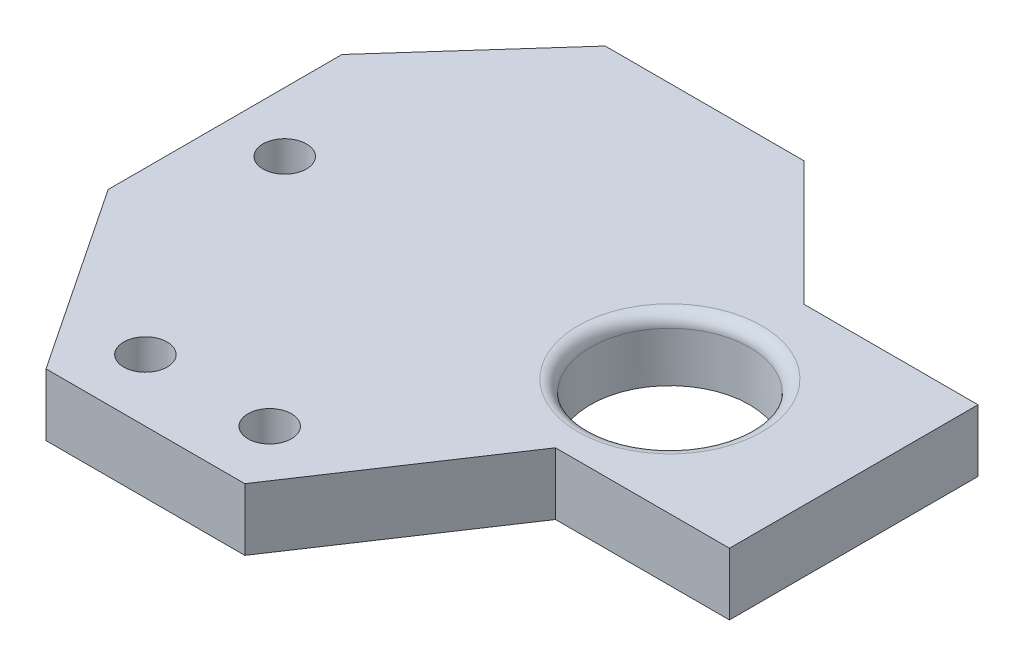
ISO-10303-21;
HEADER;
FILE_DESCRIPTION(('STEP AP214'),'2;1');
FILE_NAME('part.step','',(''),(''),'','','');
FILE_SCHEMA(('AUTOMOTIVE_DESIGN { 1 0 10303 214 1 1 1 1 }'));
ENDSEC;
DATA;
#1=APPLICATION_CONTEXT('core data for automotive mechanical design processes');
#2=APPLICATION_PROTOCOL_DEFINITION('international standard','automotive_design',2000,#1);
#3=PRODUCT_CONTEXT('',#1,'mechanical');
#4=PRODUCT('Part','Part','',(#3));
#5=PRODUCT_RELATED_PRODUCT_CATEGORY('part','',(#4));
#6=PRODUCT_DEFINITION_FORMATION('','',#4);
#7=PRODUCT_DEFINITION_CONTEXT('part definition',#1,'design');
#8=PRODUCT_DEFINITION('design','',#6,#7);
#9=PRODUCT_DEFINITION_SHAPE('','',#8);
#10=(LENGTH_UNIT() NAMED_UNIT(*) SI_UNIT(.MILLI.,.METRE.));
#11=(NAMED_UNIT(*) PLANE_ANGLE_UNIT() SI_UNIT($,.RADIAN.));
#12=(NAMED_UNIT(*) SI_UNIT($,.STERADIAN.) SOLID_ANGLE_UNIT());
#13=UNCERTAINTY_MEASURE_WITH_UNIT(LENGTH_MEASURE(1.E-05),#10,'distance_accuracy_value','');
#14=(GEOMETRIC_REPRESENTATION_CONTEXT(3) GLOBAL_UNCERTAINTY_ASSIGNED_CONTEXT((#13)) GLOBAL_UNIT_ASSIGNED_CONTEXT((#10,
#11,#12)) REPRESENTATION_CONTEXT('',''));
#15=CARTESIAN_POINT('',(0.,0.,0.));
#16=DIRECTION('',(0.,0.,1.));
#17=DIRECTION('',(1.,0.,0.));
#18=AXIS2_PLACEMENT_3D('',#15,#16,#17);
#19=CARTESIAN_POINT('',(50.,5.,0.));
#20=DIRECTION('',(-1.,0.,0.));
#21=DIRECTION('',(0.,0.,1.));
#22=AXIS2_PLACEMENT_3D('',#19,#20,#21);
#23=PLANE('',#22);
#24=DIRECTION('',(0.,0.,-1.));
#25=VECTOR('',#24,1.);
#26=CARTESIAN_POINT('',(50.,0.,0.));
#27=LINE('',#26,#25);
#28=CARTESIAN_POINT('',(50.,0.,-15.));
#29=VERTEX_POINT('',#28);
#30=CARTESIAN_POINT('',(50.,0.,-35.));
#31=VERTEX_POINT('',#30);
#32=EDGE_CURVE('E167',#29,#31,#27,.T.);
#33=ORIENTED_EDGE('',*,*,#32,.T.);
#34=DIRECTION('',(0.,-1.,0.));
#35=VECTOR('',#34,1.);
#36=CARTESIAN_POINT('',(50.,5.,-35.));
#37=LINE('',#36,#35);
#38=CARTESIAN_POINT('',(50.,5.,-35.));
#39=VERTEX_POINT('',#38);
#40=EDGE_CURVE('E222',#39,#31,#37,.T.);
#41=ORIENTED_EDGE('',*,*,#40,.F.);
#42=DIRECTION('',(0.,0.,-1.));
#43=VECTOR('',#42,1.);
#44=CARTESIAN_POINT('',(50.,5.,0.));
#45=LINE('',#44,#43);
#46=CARTESIAN_POINT('',(50.,5.,-15.));
#47=VERTEX_POINT('',#46);
#48=EDGE_CURVE('E108',#47,#39,#45,.T.);
#49=ORIENTED_EDGE('',*,*,#48,.F.);
#50=DIRECTION('',(0.,-1.,0.));
#51=VECTOR('',#50,1.);
#52=CARTESIAN_POINT('',(50.,5.,-15.));
#53=LINE('',#52,#51);
#54=EDGE_CURVE('E154',#47,#29,#53,.T.);
#55=ORIENTED_EDGE('',*,*,#54,.T.);
#56=EDGE_LOOP('',(#33,#41,#49,#55));
#57=FACE_BOUND('',#56,.T.);
#58=ADVANCED_FACE('F43',(#57),#23,.F.);
#59=CARTESIAN_POINT('',(0.,5.,-35.));
#60=DIRECTION('',(0.,0.,-1.));
#61=DIRECTION('',(-1.,0.,0.));
#62=AXIS2_PLACEMENT_3D('',#59,#60,#61);
#63=PLANE('',#62);
#64=DIRECTION('',(1.,0.,0.));
#65=VECTOR('',#64,1.);
#66=CARTESIAN_POINT('',(0.,0.,-35.));
#67=LINE('',#66,#65);
#68=CARTESIAN_POINT('',(36.,0.,-35.));
#69=VERTEX_POINT('',#68);
#70=EDGE_CURVE('E171',#69,#31,#67,.T.);
#71=ORIENTED_EDGE('',*,*,#70,.F.);
#72=DIRECTION('',(0.,-1.,0.));
#73=VECTOR('',#72,1.);
#74=CARTESIAN_POINT('',(36.,5.,-35.));
#75=LINE('',#74,#73);
#76=CARTESIAN_POINT('',(36.,5.,-35.));
#77=VERTEX_POINT('',#76);
#78=EDGE_CURVE('E219',#77,#69,#75,.T.);
#79=ORIENTED_EDGE('',*,*,#78,.F.);
#80=DIRECTION('',(1.,0.,0.));
#81=VECTOR('',#80,1.);
#82=CARTESIAN_POINT('',(0.,5.,-35.));
#83=LINE('',#82,#81);
#84=EDGE_CURVE('E279',#77,#39,#83,.T.);
#85=ORIENTED_EDGE('',*,*,#84,.T.);
#86=ORIENTED_EDGE('',*,*,#40,.T.);
#87=EDGE_LOOP('',(#71,#79,#85,#86));
#88=FACE_BOUND('',#87,.T.);
#89=ADVANCED_FACE('F241',(#88),#63,.T.);
#90=CARTESIAN_POINT('',(35.5,5.,-35.5));
#91=DIRECTION('',(0.707106781186547,0.,-0.707106781186548));
#92=DIRECTION('',(-0.707106781186548,0.,-0.707106781186547));
#93=AXIS2_PLACEMENT_3D('',#90,#91,#92);
#94=PLANE('',#93);
#95=DIRECTION('',(0.707106781186548,0.,0.707106781186547));
#96=VECTOR('',#95,1.);
#97=CARTESIAN_POINT('',(35.5,0.,-35.5));
#98=LINE('',#97,#96);
#99=CARTESIAN_POINT('',(26.,0.,-45.));
#100=VERTEX_POINT('',#99);
#101=EDGE_CURVE('E175',#100,#69,#98,.T.);
#102=ORIENTED_EDGE('',*,*,#101,.F.);
#103=DIRECTION('',(0.,-1.,0.));
#104=VECTOR('',#103,1.);
#105=CARTESIAN_POINT('',(26.,5.,-45.));
#106=LINE('',#105,#104);
#107=CARTESIAN_POINT('',(26.,5.,-45.));
#108=VERTEX_POINT('',#107);
#109=EDGE_CURVE('E216',#108,#100,#106,.T.);
#110=ORIENTED_EDGE('',*,*,#109,.F.);
#111=DIRECTION('',(0.707106781186548,0.,0.707106781186547));
#112=VECTOR('',#111,1.);
#113=CARTESIAN_POINT('',(35.5,5.,-35.5));
#114=LINE('',#113,#112);
#115=EDGE_CURVE('E284',#108,#77,#114,.T.);
#116=ORIENTED_EDGE('',*,*,#115,.T.);
#117=ORIENTED_EDGE('',*,*,#78,.T.);
#118=EDGE_LOOP('',(#102,#110,#116,#117));
#119=FACE_BOUND('',#118,.T.);
#120=ADVANCED_FACE('F247',(#119),#94,.T.);
#121=CARTESIAN_POINT('',(0.,5.,-45.));
#122=DIRECTION('',(0.,0.,-1.));
#123=DIRECTION('',(-1.,0.,0.));
#124=AXIS2_PLACEMENT_3D('',#121,#122,#123);
#125=PLANE('',#124);
#126=DIRECTION('',(1.,0.,0.));
#127=VECTOR('',#126,1.);
#128=CARTESIAN_POINT('',(0.,0.,-45.));
#129=LINE('',#128,#127);
#130=CARTESIAN_POINT('',(10.,0.,-45.));
#131=VERTEX_POINT('',#130);
#132=EDGE_CURVE('E179',#131,#100,#129,.T.);
#133=ORIENTED_EDGE('',*,*,#132,.F.);
#134=DIRECTION('',(0.,-1.,0.));
#135=VECTOR('',#134,1.);
#136=CARTESIAN_POINT('',(10.,5.,-45.));
#137=LINE('',#136,#135);
#138=CARTESIAN_POINT('',(10.,5.,-45.));
#139=VERTEX_POINT('',#138);
#140=EDGE_CURVE('E213',#139,#131,#137,.T.);
#141=ORIENTED_EDGE('',*,*,#140,.F.);
#142=DIRECTION('',(1.,0.,0.));
#143=VECTOR('',#142,1.);
#144=CARTESIAN_POINT('',(0.,5.,-45.));
#145=LINE('',#144,#143);
#146=EDGE_CURVE('E293',#139,#108,#145,.T.);
#147=ORIENTED_EDGE('',*,*,#146,.T.);
#148=ORIENTED_EDGE('',*,*,#109,.T.);
#149=EDGE_LOOP('',(#133,#141,#147,#148));
#150=FACE_BOUND('',#149,.T.);
#151=ADVANCED_FACE('F330',(#150),#125,.T.);
#152=CARTESIAN_POINT('',(-16.8051242194423,5.,-15.0309600500005));
#153=DIRECTION('',(-0.74535599249993,0.,-0.666666666666667));
#154=DIRECTION('',(-0.666666666666667,0.,0.74535599249993));
#155=AXIS2_PLACEMENT_3D('',#152,#153,#154);
#156=PLANE('',#155);
#157=DIRECTION('',(0.666666666666667,0.,-0.74535599249993));
#158=VECTOR('',#157,1.);
#159=CARTESIAN_POINT('',(-16.8051242194423,0.,-15.0309600500005));
#160=LINE('',#159,#158);
#161=CARTESIAN_POINT('',(0.,0.,-33.8196601125011));
#162=VERTEX_POINT('',#161);
#163=EDGE_CURVE('E183',#162,#131,#160,.T.);
#164=ORIENTED_EDGE('',*,*,#163,.F.);
#165=DIRECTION('',(0.,-1.,0.));
#166=VECTOR('',#165,1.);
#167=CARTESIAN_POINT('',(0.,5.,-33.8196601125011));
#168=LINE('',#167,#166);
#169=CARTESIAN_POINT('',(0.,5.,-33.8196601125011));
#170=VERTEX_POINT('',#169);
#171=EDGE_CURVE('E210',#170,#162,#168,.T.);
#172=ORIENTED_EDGE('',*,*,#171,.F.);
#173=DIRECTION('',(0.666666666666667,0.,-0.74535599249993));
#174=VECTOR('',#173,1.);
#175=CARTESIAN_POINT('',(-16.8051242194423,5.,-15.0309600500005));
#176=LINE('',#175,#174);
#177=EDGE_CURVE('E297',#170,#139,#176,.T.);
#178=ORIENTED_EDGE('',*,*,#177,.T.);
#179=ORIENTED_EDGE('',*,*,#140,.T.);
#180=EDGE_LOOP('',(#164,#172,#178,#179));
#181=FACE_BOUND('',#180,.T.);
#182=ADVANCED_FACE('F313',(#181),#156,.T.);
#183=CARTESIAN_POINT('',(0.,5.,0.));
#184=DIRECTION('',(-1.,0.,0.));
#185=DIRECTION('',(0.,0.,1.));
#186=AXIS2_PLACEMENT_3D('',#183,#184,#185);
#187=PLANE('',#186);
#188=DIRECTION('',(0.,0.,-1.));
#189=VECTOR('',#188,1.);
#190=CARTESIAN_POINT('',(0.,0.,0.));
#191=LINE('',#190,#189);
#192=CARTESIAN_POINT('',(0.,0.,-15.));
#193=VERTEX_POINT('',#192);
#194=EDGE_CURVE('E187',#193,#162,#191,.T.);
#195=ORIENTED_EDGE('',*,*,#194,.F.);
#196=DIRECTION('',(0.,-1.,0.));
#197=VECTOR('',#196,1.);
#198=CARTESIAN_POINT('',(0.,5.,-15.));
#199=LINE('',#198,#197);
#200=CARTESIAN_POINT('',(0.,5.,-15.));
#201=VERTEX_POINT('',#200);
#202=EDGE_CURVE('E207',#201,#193,#199,.T.);
#203=ORIENTED_EDGE('',*,*,#202,.F.);
#204=DIRECTION('',(0.,0.,-1.));
#205=VECTOR('',#204,1.);
#206=CARTESIAN_POINT('',(0.,5.,0.));
#207=LINE('',#206,#205);
#208=EDGE_CURVE('E301',#201,#170,#207,.T.);
#209=ORIENTED_EDGE('',*,*,#208,.T.);
#210=ORIENTED_EDGE('',*,*,#171,.T.);
#211=EDGE_LOOP('',(#195,#203,#209,#210));
#212=FACE_BOUND('',#211,.T.);
#213=ADVANCED_FACE('F307',(#212),#187,.T.);
#214=CARTESIAN_POINT('',(6.92307692307692,5.,-4.61538461538462));
#215=DIRECTION('',(0.832050294337844,0.,-0.554700196225229));
#216=DIRECTION('',(-0.554700196225229,0.,-0.832050294337844));
#217=AXIS2_PLACEMENT_3D('',#214,#215,#216);
#218=PLANE('',#217);
#219=DIRECTION('',(0.554700196225229,0.,0.832050294337844));
#220=VECTOR('',#219,1.);
#221=CARTESIAN_POINT('',(6.92307692307692,0.,-4.61538461538462));
#222=LINE('',#221,#220);
#223=CARTESIAN_POINT('',(10.,0.,0.));
#224=VERTEX_POINT('',#223);
#225=EDGE_CURVE('E191',#193,#224,#222,.T.);
#226=ORIENTED_EDGE('',*,*,#225,.T.);
#227=DIRECTION('',(0.,-1.,0.));
#228=VECTOR('',#227,1.);
#229=CARTESIAN_POINT('',(10.,5.,0.));
#230=LINE('',#229,#228);
#231=CARTESIAN_POINT('',(10.,5.,0.));
#232=VERTEX_POINT('',#231);
#233=EDGE_CURVE('E147',#232,#224,#230,.T.);
#234=ORIENTED_EDGE('',*,*,#233,.F.);
#235=DIRECTION('',(0.554700196225229,0.,0.832050294337844));
#236=VECTOR('',#235,1.);
#237=CARTESIAN_POINT('',(6.92307692307692,5.,-4.61538461538462));
#238=LINE('',#237,#236);
#239=EDGE_CURVE('E136',#201,#232,#238,.T.);
#240=ORIENTED_EDGE('',*,*,#239,.F.);
#241=ORIENTED_EDGE('',*,*,#202,.T.);
#242=EDGE_LOOP('',(#226,#234,#240,#241));
#243=FACE_BOUND('',#242,.T.);
#244=ADVANCED_FACE('F317',(#243),#218,.F.);
#245=CARTESIAN_POINT('',(0.,5.,0.));
#246=DIRECTION('',(0.,0.,-1.));
#247=DIRECTION('',(-1.,0.,0.));
#248=AXIS2_PLACEMENT_3D('',#245,#246,#247);
#249=PLANE('',#248);
#250=DIRECTION('',(1.,0.,0.));
#251=VECTOR('',#250,1.);
#252=CARTESIAN_POINT('',(0.,0.,0.));
#253=LINE('',#252,#251);
#254=CARTESIAN_POINT('',(26.,0.,0.));
#255=VERTEX_POINT('',#254);
#256=EDGE_CURVE('E145',#224,#255,#253,.T.);
#257=ORIENTED_EDGE('',*,*,#256,.T.);
#258=DIRECTION('',(0.,-1.,0.));
#259=VECTOR('',#258,1.);
#260=CARTESIAN_POINT('',(26.,5.,0.));
#261=LINE('',#260,#259);
#262=CARTESIAN_POINT('',(26.,5.,0.));
#263=VERTEX_POINT('',#262);
#264=EDGE_CURVE('E142',#263,#255,#261,.T.);
#265=ORIENTED_EDGE('',*,*,#264,.F.);
#266=DIRECTION('',(1.,0.,0.));
#267=VECTOR('',#266,1.);
#268=CARTESIAN_POINT('',(0.,5.,0.));
#269=LINE('',#268,#267);
#270=EDGE_CURVE('E129',#232,#263,#269,.T.);
#271=ORIENTED_EDGE('',*,*,#270,.F.);
#272=ORIENTED_EDGE('',*,*,#233,.T.);
#273=EDGE_LOOP('',(#257,#265,#271,#272));
#274=FACE_BOUND('',#273,.T.);
#275=ADVANCED_FACE('F143',(#274),#249,.F.);
#276=CARTESIAN_POINT('',(18.,5.,12.));
#277=DIRECTION('',(-0.832050294337844,0.,-0.554700196225229));
#278=DIRECTION('',(-0.554700196225229,0.,0.832050294337844));
#279=AXIS2_PLACEMENT_3D('',#276,#277,#278);
#280=PLANE('',#279);
#281=DIRECTION('',(0.554700196225229,0.,-0.832050294337844));
#282=VECTOR('',#281,1.);
#283=CARTESIAN_POINT('',(18.,0.,12.));
#284=LINE('',#283,#282);
#285=CARTESIAN_POINT('',(36.,0.,-15.));
#286=VERTEX_POINT('',#285);
#287=EDGE_CURVE('E96',#255,#286,#284,.T.);
#288=ORIENTED_EDGE('',*,*,#287,.T.);
#289=DIRECTION('',(0.,-1.,0.));
#290=VECTOR('',#289,1.);
#291=CARTESIAN_POINT('',(36.,5.,-15.));
#292=LINE('',#291,#290);
#293=CARTESIAN_POINT('',(36.,5.,-15.));
#294=VERTEX_POINT('',#293);
#295=EDGE_CURVE('E148',#294,#286,#292,.T.);
#296=ORIENTED_EDGE('',*,*,#295,.F.);
#297=DIRECTION('',(0.554700196225229,0.,-0.832050294337844));
#298=VECTOR('',#297,1.);
#299=CARTESIAN_POINT('',(18.,5.,12.));
#300=LINE('',#299,#298);
#301=EDGE_CURVE('E133',#263,#294,#300,.T.);
#302=ORIENTED_EDGE('',*,*,#301,.F.);
#303=ORIENTED_EDGE('',*,*,#264,.T.);
#304=EDGE_LOOP('',(#288,#296,#302,#303));
#305=FACE_BOUND('',#304,.T.);
#306=ADVANCED_FACE('F150',(#305),#280,.F.);
#307=CARTESIAN_POINT('',(23.,5.,-5.));
#308=DIRECTION('',(0.,-1.,0.));
#309=DIRECTION('',(0.,0.,-1.));
#310=AXIS2_PLACEMENT_3D('',#307,#308,#309);
#311=CYLINDRICAL_SURFACE('',#310,1.75);
#312=CARTESIAN_POINT('',(23.,5.,-5.));
#313=DIRECTION('',(0.,1.,0.));
#314=DIRECTION('',(0.,0.,1.));
#315=AXIS2_PLACEMENT_3D('',#312,#313,#314);
#316=CIRCLE('',#315,1.75);
#317=CARTESIAN_POINT('',(23.,5.,-3.25));
#318=VERTEX_POINT('',#317);
#319=EDGE_CURVE('E280',#318,#318,#316,.T.);
#320=ORIENTED_EDGE('',*,*,#319,.T.);
#321=EDGE_LOOP('',(#320));
#322=FACE_BOUND('',#321,.T.);
#323=CARTESIAN_POINT('',(23.,0.,-5.));
#324=DIRECTION('',(0.,1.,0.));
#325=DIRECTION('',(0.,0.,1.));
#326=AXIS2_PLACEMENT_3D('',#323,#324,#325);
#327=CIRCLE('',#326,1.75);
#328=CARTESIAN_POINT('',(23.,0.,-3.25));
#329=VERTEX_POINT('',#328);
#330=EDGE_CURVE('E162',#329,#329,#327,.T.);
#331=ORIENTED_EDGE('',*,*,#330,.F.);
#332=EDGE_LOOP('',(#331));
#333=FACE_BOUND('',#332,.T.);
#334=ADVANCED_FACE('F252',(#322,#333),#311,.F.);
#335=CARTESIAN_POINT('',(13.,5.,-5.));
#336=DIRECTION('',(0.,-1.,0.));
#337=DIRECTION('',(0.,0.,-1.));
#338=AXIS2_PLACEMENT_3D('',#335,#336,#337);
#339=CYLINDRICAL_SURFACE('',#338,1.75);
#340=CARTESIAN_POINT('',(13.,5.,-5.));
#341=DIRECTION('',(0.,1.,0.));
#342=DIRECTION('',(0.,0.,1.));
#343=AXIS2_PLACEMENT_3D('',#340,#341,#342);
#344=CIRCLE('',#343,1.75);
#345=CARTESIAN_POINT('',(13.,5.,-3.25));
#346=VERTEX_POINT('',#345);
#347=EDGE_CURVE('E200',#346,#346,#344,.T.);
#348=ORIENTED_EDGE('',*,*,#347,.T.);
#349=EDGE_LOOP('',(#348));
#350=FACE_BOUND('',#349,.T.);
#351=CARTESIAN_POINT('',(13.,0.,-5.));
#352=DIRECTION('',(0.,1.,0.));
#353=DIRECTION('',(0.,0.,1.));
#354=AXIS2_PLACEMENT_3D('',#351,#352,#353);
#355=CIRCLE('',#354,1.75);
#356=CARTESIAN_POINT('',(13.,0.,-3.25));
#357=VERTEX_POINT('',#356);
#358=EDGE_CURVE('E158',#357,#357,#355,.T.);
#359=ORIENTED_EDGE('',*,*,#358,.F.);
#360=EDGE_LOOP('',(#359));
#361=FACE_BOUND('',#360,.T.);
#362=ADVANCED_FACE('F254',(#350,#361),#339,.F.);
#363=CARTESIAN_POINT('',(0.,5.,-15.));
#364=DIRECTION('',(0.,0.,-1.));
#365=DIRECTION('',(-1.,0.,0.));
#366=AXIS2_PLACEMENT_3D('',#363,#364,#365);
#367=PLANE('',#366);
#368=DIRECTION('',(1.,0.,0.));
#369=VECTOR('',#368,1.);
#370=CARTESIAN_POINT('',(0.,0.,-15.));
#371=LINE('',#370,#369);
#372=EDGE_CURVE('E102',#286,#29,#371,.T.);
#373=ORIENTED_EDGE('',*,*,#372,.T.);
#374=ORIENTED_EDGE('',*,*,#54,.F.);
#375=DIRECTION('',(1.,0.,0.));
#376=VECTOR('',#375,1.);
#377=CARTESIAN_POINT('',(0.,5.,-15.));
#378=LINE('',#377,#376);
#379=EDGE_CURVE('E61',#294,#47,#378,.T.);
#380=ORIENTED_EDGE('',*,*,#379,.F.);
#381=ORIENTED_EDGE('',*,*,#295,.T.);
#382=EDGE_LOOP('',(#373,#374,#380,#381));
#383=FACE_BOUND('',#382,.T.);
#384=ADVANCED_FACE('F257',(#383),#367,.F.);
#385=CARTESIAN_POINT('',(0.,5.,0.));
#386=DIRECTION('',(0.,1.,0.));
#387=DIRECTION('',(0.,0.,1.));
#388=AXIS2_PLACEMENT_3D('',#385,#386,#387);
#389=PLANE('',#388);
#390=CARTESIAN_POINT('',(35.8,5.,-24.4098300562505));
#391=DIRECTION('',(0.,1.,0.));
#392=DIRECTION('',(0.,0.,1.));
#393=AXIS2_PLACEMENT_3D('',#390,#391,#392);
#394=CIRCLE('',#393,7.4);
#395=CARTESIAN_POINT('',(35.8,5.,-17.0098300562505));
#396=VERTEX_POINT('',#395);
#397=EDGE_CURVE('E11',#396,#396,#394,.F.);
#398=ORIENTED_EDGE('',*,*,#397,.T.);
#399=EDGE_LOOP('',(#398));
#400=FACE_BOUND('',#399,.T.);
#401=CARTESIAN_POINT('',(4.8,5.,-24.4098300562505));
#402=DIRECTION('',(0.,1.,0.));
#403=DIRECTION('',(0.,0.,1.));
#404=AXIS2_PLACEMENT_3D('',#401,#402,#403);
#405=CIRCLE('',#404,1.75);
#406=CARTESIAN_POINT('',(4.8,5.,-22.6598300562505));
#407=VERTEX_POINT('',#406);
#408=EDGE_CURVE('E163',#407,#407,#405,.T.);
#409=ORIENTED_EDGE('',*,*,#408,.F.);
#410=EDGE_LOOP('',(#409));
#411=FACE_BOUND('',#410,.T.);
#412=ORIENTED_EDGE('',*,*,#347,.F.);
#413=EDGE_LOOP('',(#412));
#414=FACE_BOUND('',#413,.T.);
#415=ORIENTED_EDGE('',*,*,#319,.F.);
#416=EDGE_LOOP('',(#415));
#417=FACE_BOUND('',#416,.T.);
#418=ORIENTED_EDGE('',*,*,#48,.T.);
#419=ORIENTED_EDGE('',*,*,#84,.F.);
#420=ORIENTED_EDGE('',*,*,#115,.F.);
#421=ORIENTED_EDGE('',*,*,#146,.F.);
#422=ORIENTED_EDGE('',*,*,#177,.F.);
#423=ORIENTED_EDGE('',*,*,#208,.F.);
#424=ORIENTED_EDGE('',*,*,#239,.T.);
#425=ORIENTED_EDGE('',*,*,#270,.T.);
#426=ORIENTED_EDGE('',*,*,#301,.T.);
#427=ORIENTED_EDGE('',*,*,#379,.T.);
#428=EDGE_LOOP('',(#418,#419,#420,#421,#422,#423,#424,#425,#426,#427));
#429=FACE_BOUND('',#428,.T.);
#430=ADVANCED_FACE('F131',(#400,#411,#414,#417,#429),#389,.T.);
#431=CARTESIAN_POINT('',(0.,0.,0.));
#432=DIRECTION('',(0.,1.,0.));
#433=DIRECTION('',(0.,0.,1.));
#434=AXIS2_PLACEMENT_3D('',#431,#432,#433);
#435=PLANE('',#434);
#436=CARTESIAN_POINT('',(4.8,0.,-24.4098300562505));
#437=DIRECTION('',(0.,-1.,0.));
#438=DIRECTION('',(0.,0.,-1.));
#439=AXIS2_PLACEMENT_3D('',#436,#437,#438);
#440=CIRCLE('',#439,1.75);
#441=CARTESIAN_POINT('',(4.8,0.,-26.1598300562505));
#442=VERTEX_POINT('',#441);
#443=EDGE_CURVE('E451',#442,#442,#440,.T.);
#444=ORIENTED_EDGE('',*,*,#443,.F.);
#445=EDGE_LOOP('',(#444));
#446=FACE_BOUND('',#445,.T.);
#447=CARTESIAN_POINT('',(35.8,0.,-24.4098300562505));
#448=DIRECTION('',(0.,-1.,0.));
#449=DIRECTION('',(0.,0.,-1.));
#450=AXIS2_PLACEMENT_3D('',#447,#448,#449);
#451=CIRCLE('',#450,6.4);
#452=CARTESIAN_POINT('',(35.8,0.,-30.8098300562505));
#453=VERTEX_POINT('',#452);
#454=EDGE_CURVE('E452',#453,#453,#451,.T.);
#455=ORIENTED_EDGE('',*,*,#454,.F.);
#456=EDGE_LOOP('',(#455));
#457=FACE_BOUND('',#456,.T.);
#458=ORIENTED_EDGE('',*,*,#358,.T.);
#459=EDGE_LOOP('',(#458));
#460=FACE_BOUND('',#459,.T.);
#461=ORIENTED_EDGE('',*,*,#330,.T.);
#462=EDGE_LOOP('',(#461));
#463=FACE_BOUND('',#462,.T.);
#464=ORIENTED_EDGE('',*,*,#32,.F.);
#465=ORIENTED_EDGE('',*,*,#372,.F.);
#466=ORIENTED_EDGE('',*,*,#287,.F.);
#467=ORIENTED_EDGE('',*,*,#256,.F.);
#468=ORIENTED_EDGE('',*,*,#225,.F.);
#469=ORIENTED_EDGE('',*,*,#194,.T.);
#470=ORIENTED_EDGE('',*,*,#163,.T.);
#471=ORIENTED_EDGE('',*,*,#132,.T.);
#472=ORIENTED_EDGE('',*,*,#101,.T.);
#473=ORIENTED_EDGE('',*,*,#70,.T.);
#474=EDGE_LOOP('',(#464,#465,#466,#467,#468,#469,#470,#471,#472,#473));
#475=FACE_BOUND('',#474,.T.);
#476=ADVANCED_FACE('F268',(#446,#457,#460,#463,#475),#435,.F.);
#477=CARTESIAN_POINT('',(35.8,10.,-24.4098300562505));
#478=DIRECTION('',(0.,-1.,0.));
#479=DIRECTION('',(0.,0.,-1.));
#480=AXIS2_PLACEMENT_3D('',#477,#478,#479);
#481=CYLINDRICAL_SURFACE('',#480,6.4);
#482=CARTESIAN_POINT('',(35.8,4.,-24.4098300562505));
#483=DIRECTION('',(0.,1.,0.));
#484=DIRECTION('',(0.,0.,1.));
#485=AXIS2_PLACEMENT_3D('',#482,#483,#484);
#486=CIRCLE('',#485,6.4);
#487=CARTESIAN_POINT('',(35.8,4.,-18.0098300562505));
#488=VERTEX_POINT('',#487);
#489=EDGE_CURVE('E53',#488,#488,#486,.T.);
#490=ORIENTED_EDGE('',*,*,#489,.T.);
#491=EDGE_LOOP('',(#490));
#492=FACE_BOUND('',#491,.T.);
#493=ORIENTED_EDGE('',*,*,#454,.T.);
#494=EDGE_LOOP('',(#493));
#495=FACE_BOUND('',#494,.T.);
#496=ADVANCED_FACE('F228',(#492,#495),#481,.F.);
#497=CARTESIAN_POINT('',(4.8,10.,-24.4098300562505));
#498=DIRECTION('',(0.,-1.,0.));
#499=DIRECTION('',(0.,0.,-1.));
#500=AXIS2_PLACEMENT_3D('',#497,#498,#499);
#501=CYLINDRICAL_SURFACE('',#500,1.75);
#502=ORIENTED_EDGE('',*,*,#408,.T.);
#503=EDGE_LOOP('',(#502));
#504=FACE_BOUND('',#503,.T.);
#505=ORIENTED_EDGE('',*,*,#443,.T.);
#506=EDGE_LOOP('',(#505));
#507=FACE_BOUND('',#506,.T.);
#508=ADVANCED_FACE('F232',(#504,#507),#501,.F.);
#509=CARTESIAN_POINT('',(35.8,4.,-24.4098300562505));
#510=DIRECTION('',(0.,1.,0.));
#511=DIRECTION('',(0.,0.,1.));
#512=AXIS2_PLACEMENT_3D('',#509,#510,#511);
#513=TOROIDAL_SURFACE('',#512,7.4,1.);
#514=ORIENTED_EDGE('',*,*,#397,.F.);
#515=EDGE_LOOP('',(#514));
#516=FACE_BOUND('',#515,.T.);
#517=ORIENTED_EDGE('',*,*,#489,.F.);
#518=EDGE_LOOP('',(#517));
#519=FACE_BOUND('',#518,.T.);
#520=ADVANCED_FACE('F45',(#516,#519),#513,.T.);
#521=CLOSED_SHELL('',(#58,#89,#120,#151,#182,#213,#244,#275,#306,#334,#362,#384,#430,#476,#496,
#508,#520));
#522=MANIFOLD_SOLID_BREP('B2',#521);
#523=ADVANCED_BREP_SHAPE_REPRESENTATION('',(#18,#522),#14);
#524=SHAPE_DEFINITION_REPRESENTATION(#9,#523);
ENDSEC;
END-ISO-10303-21;
